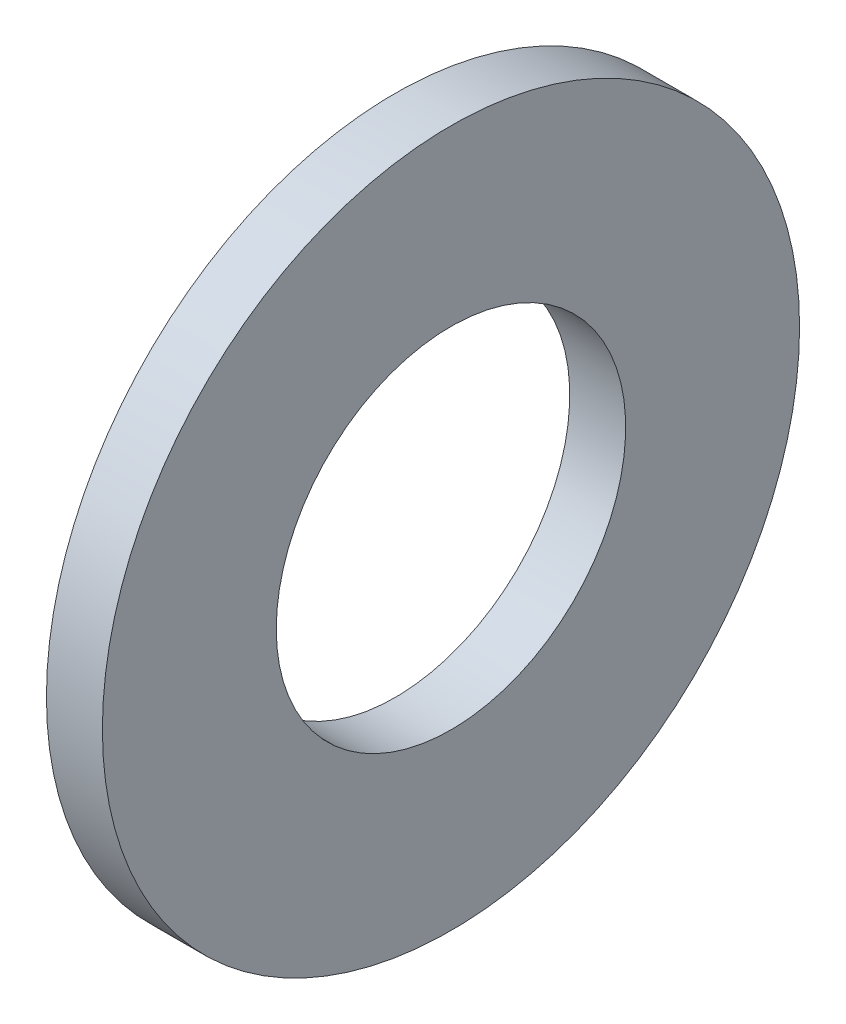
ISO-10303-21;
HEADER;
FILE_DESCRIPTION(('STEP AP214'),'2;1');
FILE_NAME('part.step','',(''),(''),'','','');
FILE_SCHEMA(('AUTOMOTIVE_DESIGN { 1 0 10303 214 1 1 1 1 }'));
ENDSEC;
DATA;
#1=APPLICATION_CONTEXT('core data for automotive mechanical design processes');
#2=APPLICATION_PROTOCOL_DEFINITION('international standard','automotive_design',2000,#1);
#3=PRODUCT_CONTEXT('',#1,'mechanical');
#4=PRODUCT('Part','Part','',(#3));
#5=PRODUCT_RELATED_PRODUCT_CATEGORY('part','',(#4));
#6=PRODUCT_DEFINITION_FORMATION('','',#4);
#7=PRODUCT_DEFINITION_CONTEXT('part definition',#1,'design');
#8=PRODUCT_DEFINITION('design','',#6,#7);
#9=PRODUCT_DEFINITION_SHAPE('','',#8);
#10=(LENGTH_UNIT() NAMED_UNIT(*) SI_UNIT(.MILLI.,.METRE.));
#11=(NAMED_UNIT(*) PLANE_ANGLE_UNIT() SI_UNIT($,.RADIAN.));
#12=(NAMED_UNIT(*) SI_UNIT($,.STERADIAN.) SOLID_ANGLE_UNIT());
#13=UNCERTAINTY_MEASURE_WITH_UNIT(LENGTH_MEASURE(1.E-05),#10,'distance_accuracy_value','');
#14=(GEOMETRIC_REPRESENTATION_CONTEXT(3) GLOBAL_UNCERTAINTY_ASSIGNED_CONTEXT((#13)) GLOBAL_UNIT_ASSIGNED_CONTEXT((#10,
#11,#12)) REPRESENTATION_CONTEXT('',''));
#15=CARTESIAN_POINT('',(0.,0.,0.));
#16=DIRECTION('',(0.,0.,1.));
#17=DIRECTION('',(1.,0.,0.));
#18=AXIS2_PLACEMENT_3D('',#15,#16,#17);
#19=CARTESIAN_POINT('',(0.,5.1562,0.));
#20=DIRECTION('',(1.,0.,0.));
#21=DIRECTION('',(0.,0.,-1.));
#22=AXIS2_PLACEMENT_3D('',#19,#20,#21);
#23=PLANE('',#22);
#24=CARTESIAN_POINT('',(0.,0.,0.));
#25=DIRECTION('',(-1.,0.,0.));
#26=DIRECTION('',(0.,0.,1.));
#27=AXIS2_PLACEMENT_3D('',#24,#25,#26);
#28=CIRCLE('',#27,5.1562);
#29=CARTESIAN_POINT('',(0.,0.,5.1562));
#30=VERTEX_POINT('',#29);
#31=EDGE_CURVE('E45',#30,#30,#28,.T.);
#32=ORIENTED_EDGE('',*,*,#31,.F.);
#33=EDGE_LOOP('',(#32));
#34=FACE_BOUND('',#33,.T.);
#35=CARTESIAN_POINT('',(0.,0.,0.));
#36=DIRECTION('',(-1.,0.,0.));
#37=DIRECTION('',(0.,0.,1.));
#38=AXIS2_PLACEMENT_3D('',#35,#36,#37);
#39=CIRCLE('',#38,10.287);
#40=CARTESIAN_POINT('',(0.,0.,10.287));
#41=VERTEX_POINT('',#40);
#42=EDGE_CURVE('E10',#41,#41,#39,.T.);
#43=ORIENTED_EDGE('',*,*,#42,.T.);
#44=EDGE_LOOP('',(#43));
#45=FACE_BOUND('',#44,.T.);
#46=ADVANCED_FACE('F31',(#34,#45),#23,.F.);
#47=CARTESIAN_POINT('',(0.,0.,0.));
#48=DIRECTION('',(-1.,0.,0.));
#49=DIRECTION('',(0.,0.,1.));
#50=AXIS2_PLACEMENT_3D('',#47,#48,#49);
#51=CYLINDRICAL_SURFACE('',#50,10.287);
#52=ORIENTED_EDGE('',*,*,#42,.F.);
#53=EDGE_LOOP('',(#52));
#54=FACE_BOUND('',#53,.T.);
#55=CARTESIAN_POINT('',(1.651,0.,0.));
#56=DIRECTION('',(-1.,0.,0.));
#57=DIRECTION('',(0.,0.,1.));
#58=AXIS2_PLACEMENT_3D('',#55,#56,#57);
#59=CIRCLE('',#58,10.287);
#60=CARTESIAN_POINT('',(1.651,0.,10.287));
#61=VERTEX_POINT('',#60);
#62=EDGE_CURVE('E37',#61,#61,#59,.T.);
#63=ORIENTED_EDGE('',*,*,#62,.T.);
#64=EDGE_LOOP('',(#63));
#65=FACE_BOUND('',#64,.T.);
#66=ADVANCED_FACE('F54',(#54,#65),#51,.T.);
#67=CARTESIAN_POINT('',(1.651,5.1562,0.));
#68=DIRECTION('',(-1.,0.,0.));
#69=DIRECTION('',(0.,0.,1.));
#70=AXIS2_PLACEMENT_3D('',#67,#68,#69);
#71=PLANE('',#70);
#72=ORIENTED_EDGE('',*,*,#62,.F.);
#73=EDGE_LOOP('',(#72));
#74=FACE_BOUND('',#73,.T.);
#75=CARTESIAN_POINT('',(1.651,0.,0.));
#76=DIRECTION('',(-1.,0.,0.));
#77=DIRECTION('',(0.,0.,1.));
#78=AXIS2_PLACEMENT_3D('',#75,#76,#77);
#79=CIRCLE('',#78,5.1562);
#80=CARTESIAN_POINT('',(1.651,0.,5.1562));
#81=VERTEX_POINT('',#80);
#82=EDGE_CURVE('E41',#81,#81,#79,.T.);
#83=ORIENTED_EDGE('',*,*,#82,.T.);
#84=EDGE_LOOP('',(#83));
#85=FACE_BOUND('',#84,.T.);
#86=ADVANCED_FACE('F58',(#74,#85),#71,.F.);
#87=CARTESIAN_POINT('',(0.,0.,0.));
#88=DIRECTION('',(-1.,0.,0.));
#89=DIRECTION('',(0.,0.,1.));
#90=AXIS2_PLACEMENT_3D('',#87,#88,#89);
#91=CYLINDRICAL_SURFACE('',#90,5.1562);
#92=ORIENTED_EDGE('',*,*,#82,.F.);
#93=EDGE_LOOP('',(#92));
#94=FACE_BOUND('',#93,.T.);
#95=ORIENTED_EDGE('',*,*,#31,.T.);
#96=EDGE_LOOP('',(#95));
#97=FACE_BOUND('',#96,.T.);
#98=ADVANCED_FACE('F51',(#94,#97),#91,.F.);
#99=CLOSED_SHELL('',(#46,#66,#86,#98));
#100=MANIFOLD_SOLID_BREP('B2',#99);
#101=ADVANCED_BREP_SHAPE_REPRESENTATION('',(#18,#100),#14);
#102=SHAPE_DEFINITION_REPRESENTATION(#9,#101);
ENDSEC;
END-ISO-10303-21;
